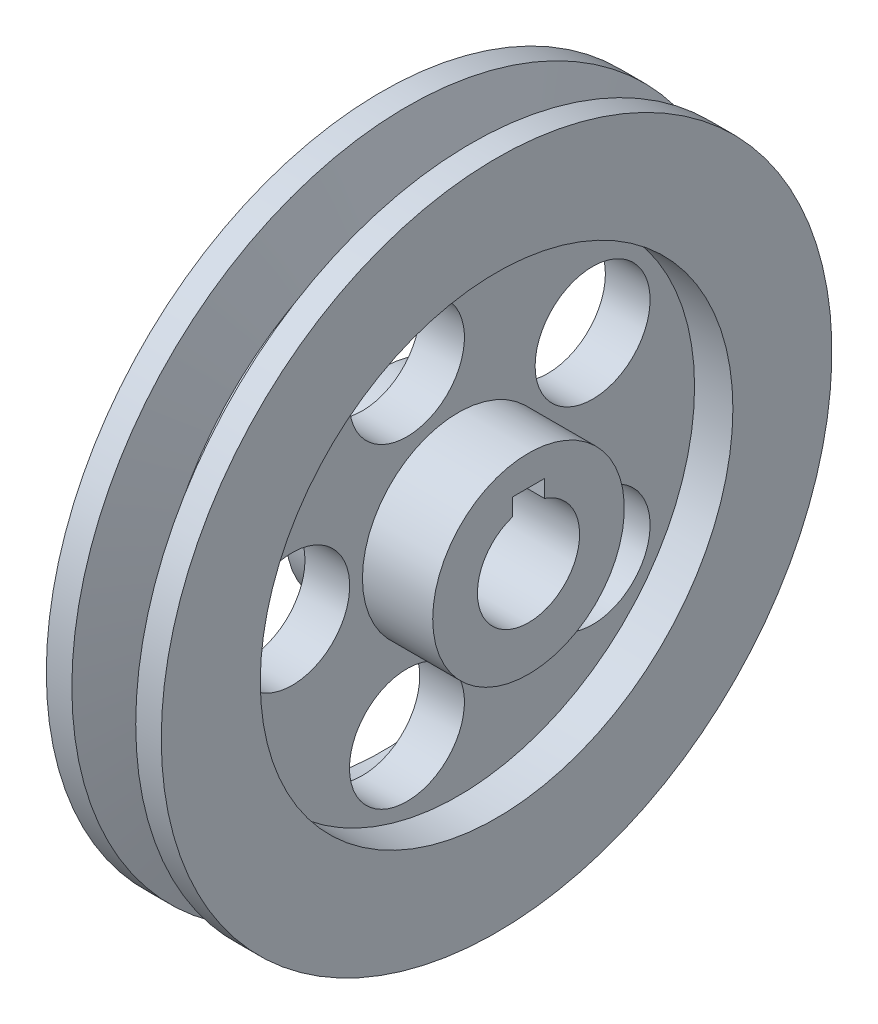
ISO-10303-21;
HEADER;
FILE_DESCRIPTION(('STEP AP214'),'2;1');
FILE_NAME('part.step','',(''),(''),'','','');
FILE_SCHEMA(('AUTOMOTIVE_DESIGN { 1 0 10303 214 1 1 1 1 }'));
ENDSEC;
DATA;
#1=APPLICATION_CONTEXT('core data for automotive mechanical design processes');
#2=APPLICATION_PROTOCOL_DEFINITION('international standard','automotive_design',2000,#1);
#3=PRODUCT_CONTEXT('',#1,'mechanical');
#4=PRODUCT('Part','Part','',(#3));
#5=PRODUCT_RELATED_PRODUCT_CATEGORY('part','',(#4));
#6=PRODUCT_DEFINITION_FORMATION('','',#4);
#7=PRODUCT_DEFINITION_CONTEXT('part definition',#1,'design');
#8=PRODUCT_DEFINITION('design','',#6,#7);
#9=PRODUCT_DEFINITION_SHAPE('','',#8);
#10=(LENGTH_UNIT() NAMED_UNIT(*) SI_UNIT(.MILLI.,.METRE.));
#11=(NAMED_UNIT(*) PLANE_ANGLE_UNIT() SI_UNIT($,.RADIAN.));
#12=(NAMED_UNIT(*) SI_UNIT($,.STERADIAN.) SOLID_ANGLE_UNIT());
#13=UNCERTAINTY_MEASURE_WITH_UNIT(LENGTH_MEASURE(1.E-05),#10,'distance_accuracy_value','');
#14=(GEOMETRIC_REPRESENTATION_CONTEXT(3) GLOBAL_UNCERTAINTY_ASSIGNED_CONTEXT((#13)) GLOBAL_UNIT_ASSIGNED_CONTEXT((#10,
#11,#12)) REPRESENTATION_CONTEXT('',''));
#15=CARTESIAN_POINT('',(0.,0.,0.));
#16=DIRECTION('',(0.,0.,1.));
#17=DIRECTION('',(1.,0.,0.));
#18=AXIS2_PLACEMENT_3D('',#15,#16,#17);
#19=CARTESIAN_POINT('',(0.,15.,0.));
#20=DIRECTION('',(1.,0.,0.));
#21=DIRECTION('',(0.,0.,-1.));
#22=AXIS2_PLACEMENT_3D('',#19,#20,#21);
#23=PLANE('',#22);
#24=CARTESIAN_POINT('',(0.,0.,0.));
#25=DIRECTION('',(-1.,0.,0.));
#26=DIRECTION('',(0.,0.,1.));
#27=AXIS2_PLACEMENT_3D('',#24,#25,#26);
#28=CIRCLE('',#27,15.);
#29=CARTESIAN_POINT('',(0.,0.,15.));
#30=VERTEX_POINT('',#29);
#31=EDGE_CURVE('E108',#30,#30,#28,.T.);
#32=ORIENTED_EDGE('',*,*,#31,.T.);
#33=EDGE_LOOP('',(#32));
#34=FACE_BOUND('',#33,.T.);
#35=DIRECTION('',(0.,1.,0.));
#36=VECTOR('',#35,1.);
#37=CARTESIAN_POINT('',(0.,15.,2.5));
#38=LINE('',#37,#36);
#39=CARTESIAN_POINT('',(0.,7.59934207678533,2.5));
#40=VERTEX_POINT('',#39);
#41=CARTESIAN_POINT('',(0.,10.3,2.5));
#42=VERTEX_POINT('',#41);
#43=EDGE_CURVE('E99',#40,#42,#38,.T.);
#44=ORIENTED_EDGE('',*,*,#43,.F.);
#45=CARTESIAN_POINT('',(0.,0.,0.));
#46=DIRECTION('',(1.,0.,0.));
#47=DIRECTION('',(0.,0.,-1.));
#48=AXIS2_PLACEMENT_3D('',#45,#46,#47);
#49=CIRCLE('',#48,8.);
#50=CARTESIAN_POINT('',(0.,7.59934207678533,-2.5));
#51=VERTEX_POINT('',#50);
#52=EDGE_CURVE('E105',#51,#40,#49,.F.);
#53=ORIENTED_EDGE('',*,*,#52,.F.);
#54=DIRECTION('',(0.,-1.,0.));
#55=VECTOR('',#54,1.);
#56=CARTESIAN_POINT('',(0.,15.,-2.5));
#57=LINE('',#56,#55);
#58=CARTESIAN_POINT('',(0.,10.3,-2.5));
#59=VERTEX_POINT('',#58);
#60=EDGE_CURVE('E55',#59,#51,#57,.T.);
#61=ORIENTED_EDGE('',*,*,#60,.F.);
#62=DIRECTION('',(0.,0.,-1.));
#63=VECTOR('',#62,1.);
#64=CARTESIAN_POINT('',(0.,10.3,0.));
#65=LINE('',#64,#63);
#66=EDGE_CURVE('E94',#42,#59,#65,.T.);
#67=ORIENTED_EDGE('',*,*,#66,.F.);
#68=EDGE_LOOP('',(#44,#53,#61,#67));
#69=FACE_BOUND('',#68,.T.);
#70=ADVANCED_FACE('F39',(#34,#69),#23,.F.);
#71=CARTESIAN_POINT('',(23.,0.,0.));
#72=DIRECTION('',(-1.,0.,0.));
#73=DIRECTION('',(0.,0.,1.));
#74=AXIS2_PLACEMENT_3D('',#71,#72,#73);
#75=PLANE('',#74);
#76=CARTESIAN_POINT('',(23.,0.,0.));
#77=DIRECTION('',(-1.,0.,0.));
#78=DIRECTION('',(0.,0.,1.));
#79=AXIS2_PLACEMENT_3D('',#76,#77,#78);
#80=CIRCLE('',#79,15.);
#81=CARTESIAN_POINT('',(23.,0.,15.));
#82=VERTEX_POINT('',#81);
#83=EDGE_CURVE('E147',#82,#82,#80,.T.);
#84=ORIENTED_EDGE('',*,*,#83,.F.);
#85=EDGE_LOOP('',(#84));
#86=FACE_BOUND('',#85,.T.);
#87=DIRECTION('',(0.,-1.,0.));
#88=VECTOR('',#87,1.);
#89=CARTESIAN_POINT('',(23.,0.,2.5));
#90=LINE('',#89,#88);
#91=CARTESIAN_POINT('',(23.,10.3,2.5));
#92=VERTEX_POINT('',#91);
#93=CARTESIAN_POINT('',(23.,7.59934207678533,2.5));
#94=VERTEX_POINT('',#93);
#95=EDGE_CURVE('E63',#92,#94,#90,.T.);
#96=ORIENTED_EDGE('',*,*,#95,.F.);
#97=DIRECTION('',(0.,0.,1.));
#98=VECTOR('',#97,1.);
#99=CARTESIAN_POINT('',(23.,10.3,0.));
#100=LINE('',#99,#98);
#101=CARTESIAN_POINT('',(23.,10.3,-2.5));
#102=VERTEX_POINT('',#101);
#103=EDGE_CURVE('E11',#102,#92,#100,.T.);
#104=ORIENTED_EDGE('',*,*,#103,.F.);
#105=DIRECTION('',(0.,1.,0.));
#106=VECTOR('',#105,1.);
#107=CARTESIAN_POINT('',(23.,0.,-2.5));
#108=LINE('',#107,#106);
#109=CARTESIAN_POINT('',(23.,7.59934207678533,-2.5));
#110=VERTEX_POINT('',#109);
#111=EDGE_CURVE('E80',#110,#102,#108,.T.);
#112=ORIENTED_EDGE('',*,*,#111,.F.);
#113=CARTESIAN_POINT('',(23.,0.,0.));
#114=DIRECTION('',(-1.,0.,0.));
#115=DIRECTION('',(0.,0.,1.));
#116=AXIS2_PLACEMENT_3D('',#113,#114,#115);
#117=CIRCLE('',#116,8.);
#118=EDGE_CURVE('E98',#94,#110,#117,.F.);
#119=ORIENTED_EDGE('',*,*,#118,.F.);
#120=EDGE_LOOP('',(#96,#104,#112,#119));
#121=FACE_BOUND('',#120,.T.);
#122=ADVANCED_FACE('F97',(#86,#121),#75,.F.);
#123=CARTESIAN_POINT('',(24.,0.,0.));
#124=DIRECTION('',(-1.,0.,0.));
#125=DIRECTION('',(0.,0.,1.));
#126=AXIS2_PLACEMENT_3D('',#123,#124,#125);
#127=CYLINDRICAL_SURFACE('',#126,8.);
#128=ORIENTED_EDGE('',*,*,#52,.T.);
#129=DIRECTION('',(-1.,0.,0.));
#130=VECTOR('',#129,1.);
#131=CARTESIAN_POINT('',(24.,7.59934207678533,2.5));
#132=LINE('',#131,#130);
#133=EDGE_CURVE('E47',#40,#94,#132,.F.);
#134=ORIENTED_EDGE('',*,*,#133,.T.);
#135=ORIENTED_EDGE('',*,*,#118,.T.);
#136=DIRECTION('',(-1.,0.,0.));
#137=VECTOR('',#136,1.);
#138=CARTESIAN_POINT('',(24.,7.59934207678533,-2.5));
#139=LINE('',#138,#137);
#140=EDGE_CURVE('E84',#110,#51,#139,.T.);
#141=ORIENTED_EDGE('',*,*,#140,.T.);
#142=EDGE_LOOP('',(#128,#134,#135,#141));
#143=FACE_BOUND('',#142,.T.);
#144=ADVANCED_FACE('F188',(#143),#127,.F.);
#145=CARTESIAN_POINT('',(-5.,0.,0.));
#146=DIRECTION('',(-1.,0.,0.));
#147=DIRECTION('',(0.,0.,1.));
#148=AXIS2_PLACEMENT_3D('',#145,#146,#147);
#149=CYLINDRICAL_SURFACE('',#148,15.);
#150=CARTESIAN_POINT('',(12.,0.,0.));
#151=DIRECTION('',(-1.,0.,0.));
#152=DIRECTION('',(0.,0.,1.));
#153=AXIS2_PLACEMENT_3D('',#150,#151,#152);
#154=CIRCLE('',#153,15.);
#155=CARTESIAN_POINT('',(12.,0.,15.));
#156=VERTEX_POINT('',#155);
#157=EDGE_CURVE('E144',#156,#156,#154,.T.);
#158=ORIENTED_EDGE('',*,*,#157,.F.);
#159=EDGE_LOOP('',(#158));
#160=FACE_BOUND('',#159,.T.);
#161=ORIENTED_EDGE('',*,*,#83,.T.);
#162=EDGE_LOOP('',(#161));
#163=FACE_BOUND('',#162,.T.);
#164=ADVANCED_FACE('F278',(#160,#163),#149,.T.);
#165=CARTESIAN_POINT('',(12.,15.,0.));
#166=DIRECTION('',(-1.,0.,0.));
#167=DIRECTION('',(0.,0.,1.));
#168=AXIS2_PLACEMENT_3D('',#165,#166,#167);
#169=PLANE('',#168);
#170=CARTESIAN_POINT('',(12.,24.727469423674,8.03444185374863));
#171=DIRECTION('',(-1.,0.,0.));
#172=DIRECTION('',(0.,0.,1.));
#173=AXIS2_PLACEMENT_3D('',#170,#171,#172);
#174=CIRCLE('',#173,9.);
#175=CARTESIAN_POINT('',(12.,24.727469423674,17.0344418537486));
#176=VERTEX_POINT('',#175);
#177=EDGE_CURVE('E167',#176,#176,#174,.F.);
#178=ORIENTED_EDGE('',*,*,#177,.F.);
#179=EDGE_LOOP('',(#178));
#180=FACE_BOUND('',#179,.T.);
#181=CARTESIAN_POINT('',(12.,15.2824165596043,-21.0344418537486));
#182=DIRECTION('',(-1.,0.,0.));
#183=DIRECTION('',(0.,0.,1.));
#184=AXIS2_PLACEMENT_3D('',#181,#182,#183);
#185=CIRCLE('',#184,9.);
#186=CARTESIAN_POINT('',(12.,15.2824165596043,-12.0344418537486));
#187=VERTEX_POINT('',#186);
#188=EDGE_CURVE('E164',#187,#187,#185,.F.);
#189=ORIENTED_EDGE('',*,*,#188,.F.);
#190=EDGE_LOOP('',(#189));
#191=FACE_BOUND('',#190,.T.);
#192=CARTESIAN_POINT('',(12.,-15.2824165596043,-21.0344418537486));
#193=DIRECTION('',(-1.,0.,0.));
#194=DIRECTION('',(0.,0.,1.));
#195=AXIS2_PLACEMENT_3D('',#192,#193,#194);
#196=CIRCLE('',#195,9.);
#197=CARTESIAN_POINT('',(12.,-15.2824165596043,-12.0344418537486));
#198=VERTEX_POINT('',#197);
#199=EDGE_CURVE('E161',#198,#198,#196,.F.);
#200=ORIENTED_EDGE('',*,*,#199,.F.);
#201=EDGE_LOOP('',(#200));
#202=FACE_BOUND('',#201,.T.);
#203=CARTESIAN_POINT('',(12.,-24.727469423674,8.03444185374864));
#204=DIRECTION('',(-1.,0.,0.));
#205=DIRECTION('',(0.,0.,1.));
#206=AXIS2_PLACEMENT_3D('',#203,#204,#205);
#207=CIRCLE('',#206,9.);
#208=CARTESIAN_POINT('',(12.,-24.727469423674,17.0344418537486));
#209=VERTEX_POINT('',#208);
#210=EDGE_CURVE('E157',#209,#209,#207,.F.);
#211=ORIENTED_EDGE('',*,*,#210,.F.);
#212=EDGE_LOOP('',(#211));
#213=FACE_BOUND('',#212,.T.);
#214=CARTESIAN_POINT('',(12.,0.,26.));
#215=DIRECTION('',(-1.,0.,0.));
#216=DIRECTION('',(0.,0.,1.));
#217=AXIS2_PLACEMENT_3D('',#214,#215,#216);
#218=CIRCLE('',#217,9.);
#219=CARTESIAN_POINT('',(12.,0.,35.));
#220=VERTEX_POINT('',#219);
#221=EDGE_CURVE('E156',#220,#220,#218,.F.);
#222=ORIENTED_EDGE('',*,*,#221,.F.);
#223=EDGE_LOOP('',(#222));
#224=FACE_BOUND('',#223,.T.);
#225=CARTESIAN_POINT('',(12.,0.,0.));
#226=DIRECTION('',(-1.,0.,0.));
#227=DIRECTION('',(0.,0.,1.));
#228=AXIS2_PLACEMENT_3D('',#225,#226,#227);
#229=CIRCLE('',#228,37.);
#230=CARTESIAN_POINT('',(12.,0.,37.));
#231=VERTEX_POINT('',#230);
#232=EDGE_CURVE('E141',#231,#231,#229,.T.);
#233=ORIENTED_EDGE('',*,*,#232,.F.);
#234=EDGE_LOOP('',(#233));
#235=FACE_BOUND('',#234,.T.);
#236=ORIENTED_EDGE('',*,*,#157,.T.);
#237=EDGE_LOOP('',(#236));
#238=FACE_BOUND('',#237,.T.);
#239=ADVANCED_FACE('F272',(#180,#191,#202,#213,#224,#235,#238),#169,.F.);
#240=CARTESIAN_POINT('',(-5.,0.,0.));
#241=DIRECTION('',(-1.,0.,0.));
#242=DIRECTION('',(0.,0.,1.));
#243=AXIS2_PLACEMENT_3D('',#240,#241,#242);
#244=CYLINDRICAL_SURFACE('',#243,37.);
#245=CARTESIAN_POINT('',(18.,0.,0.));
#246=DIRECTION('',(-1.,0.,0.));
#247=DIRECTION('',(0.,0.,1.));
#248=AXIS2_PLACEMENT_3D('',#245,#246,#247);
#249=CIRCLE('',#248,37.);
#250=CARTESIAN_POINT('',(18.,0.,37.));
#251=VERTEX_POINT('',#250);
#252=EDGE_CURVE('E138',#251,#251,#249,.T.);
#253=ORIENTED_EDGE('',*,*,#252,.F.);
#254=EDGE_LOOP('',(#253));
#255=FACE_BOUND('',#254,.T.);
#256=ORIENTED_EDGE('',*,*,#232,.T.);
#257=EDGE_LOOP('',(#256));
#258=FACE_BOUND('',#257,.T.);
#259=ADVANCED_FACE('F266',(#255,#258),#244,.F.);
#260=CARTESIAN_POINT('',(18.,37.,0.));
#261=DIRECTION('',(-1.,0.,0.));
#262=DIRECTION('',(0.,0.,1.));
#263=AXIS2_PLACEMENT_3D('',#260,#261,#262);
#264=PLANE('',#263);
#265=CARTESIAN_POINT('',(18.,0.,0.));
#266=DIRECTION('',(-1.,0.,0.));
#267=DIRECTION('',(0.,0.,1.));
#268=AXIS2_PLACEMENT_3D('',#265,#266,#267);
#269=CIRCLE('',#268,52.5);
#270=CARTESIAN_POINT('',(18.,0.,52.5));
#271=VERTEX_POINT('',#270);
#272=EDGE_CURVE('E135',#271,#271,#269,.T.);
#273=ORIENTED_EDGE('',*,*,#272,.F.);
#274=EDGE_LOOP('',(#273));
#275=FACE_BOUND('',#274,.T.);
#276=ORIENTED_EDGE('',*,*,#252,.T.);
#277=EDGE_LOOP('',(#276));
#278=FACE_BOUND('',#277,.T.);
#279=ADVANCED_FACE('F260',(#275,#278),#264,.F.);
#280=CARTESIAN_POINT('',(-5.,0.,0.));
#281=DIRECTION('',(-1.,0.,0.));
#282=DIRECTION('',(0.,0.,1.));
#283=AXIS2_PLACEMENT_3D('',#280,#281,#282);
#284=CYLINDRICAL_SURFACE('',#283,52.5);
#285=CARTESIAN_POINT('',(14.,0.,0.));
#286=DIRECTION('',(-1.,0.,0.));
#287=DIRECTION('',(0.,0.,1.));
#288=AXIS2_PLACEMENT_3D('',#285,#286,#287);
#289=CIRCLE('',#288,52.5);
#290=CARTESIAN_POINT('',(14.,0.,52.5));
#291=VERTEX_POINT('',#290);
#292=EDGE_CURVE('E132',#291,#291,#289,.T.);
#293=ORIENTED_EDGE('',*,*,#292,.F.);
#294=EDGE_LOOP('',(#293));
#295=FACE_BOUND('',#294,.T.);
#296=ORIENTED_EDGE('',*,*,#272,.T.);
#297=EDGE_LOOP('',(#296));
#298=FACE_BOUND('',#297,.T.);
#299=ADVANCED_FACE('F254',(#295,#298),#284,.T.);
#300=CARTESIAN_POINT('',(14.,0.,0.));
#301=DIRECTION('',(1.,0.,0.));
#302=DIRECTION('',(0.,0.,-1.));
#303=AXIS2_PLACEMENT_3D('',#300,#301,#302);
#304=CONICAL_SURFACE('',#303,52.5,1.30899693899575);
#305=CARTESIAN_POINT('',(11.3205080756888,0.,0.));
#306=DIRECTION('',(-1.,0.,0.));
#307=DIRECTION('',(0.,0.,1.));
#308=AXIS2_PLACEMENT_3D('',#305,#306,#307);
#309=CIRCLE('',#308,42.5);
#310=CARTESIAN_POINT('',(11.3205080756888,0.,42.5));
#311=VERTEX_POINT('',#310);
#312=EDGE_CURVE('E129',#311,#311,#309,.T.);
#313=ORIENTED_EDGE('',*,*,#312,.F.);
#314=EDGE_LOOP('',(#313));
#315=FACE_BOUND('',#314,.T.);
#316=ORIENTED_EDGE('',*,*,#292,.T.);
#317=EDGE_LOOP('',(#316));
#318=FACE_BOUND('',#317,.T.);
#319=ADVANCED_FACE('F248',(#315,#318),#304,.T.);
#320=CARTESIAN_POINT('',(-5.,0.,0.));
#321=DIRECTION('',(-1.,0.,0.));
#322=DIRECTION('',(0.,0.,1.));
#323=AXIS2_PLACEMENT_3D('',#320,#321,#322);
#324=CYLINDRICAL_SURFACE('',#323,42.5);
#325=CARTESIAN_POINT('',(6.67949192431123,0.,0.));
#326=DIRECTION('',(-1.,0.,0.));
#327=DIRECTION('',(0.,0.,1.));
#328=AXIS2_PLACEMENT_3D('',#325,#326,#327);
#329=CIRCLE('',#328,42.5);
#330=CARTESIAN_POINT('',(6.67949192431123,0.,42.5));
#331=VERTEX_POINT('',#330);
#332=EDGE_CURVE('E126',#331,#331,#329,.T.);
#333=ORIENTED_EDGE('',*,*,#332,.F.);
#334=EDGE_LOOP('',(#333));
#335=FACE_BOUND('',#334,.T.);
#336=ORIENTED_EDGE('',*,*,#312,.T.);
#337=EDGE_LOOP('',(#336));
#338=FACE_BOUND('',#337,.T.);
#339=ADVANCED_FACE('F242',(#335,#338),#324,.T.);
#340=CARTESIAN_POINT('',(6.67949192431123,0.,0.));
#341=DIRECTION('',(-1.,0.,0.));
#342=DIRECTION('',(0.,0.,1.));
#343=AXIS2_PLACEMENT_3D('',#340,#341,#342);
#344=CONICAL_SURFACE('',#343,42.5,1.30899693899575);
#345=CARTESIAN_POINT('',(4.,0.,0.));
#346=DIRECTION('',(-1.,0.,0.));
#347=DIRECTION('',(0.,0.,1.));
#348=AXIS2_PLACEMENT_3D('',#345,#346,#347);
#349=CIRCLE('',#348,52.5);
#350=CARTESIAN_POINT('',(4.,0.,52.5));
#351=VERTEX_POINT('',#350);
#352=EDGE_CURVE('E123',#351,#351,#349,.T.);
#353=ORIENTED_EDGE('',*,*,#352,.F.);
#354=EDGE_LOOP('',(#353));
#355=FACE_BOUND('',#354,.T.);
#356=ORIENTED_EDGE('',*,*,#332,.T.);
#357=EDGE_LOOP('',(#356));
#358=FACE_BOUND('',#357,.T.);
#359=ADVANCED_FACE('F236',(#355,#358),#344,.T.);
#360=CARTESIAN_POINT('',(-5.,0.,0.));
#361=DIRECTION('',(-1.,0.,0.));
#362=DIRECTION('',(0.,0.,1.));
#363=AXIS2_PLACEMENT_3D('',#360,#361,#362);
#364=CYLINDRICAL_SURFACE('',#363,52.5);
#365=CARTESIAN_POINT('',(0.,0.,0.));
#366=DIRECTION('',(-1.,0.,0.));
#367=DIRECTION('',(0.,0.,1.));
#368=AXIS2_PLACEMENT_3D('',#365,#366,#367);
#369=CIRCLE('',#368,52.5);
#370=CARTESIAN_POINT('',(0.,0.,52.5));
#371=VERTEX_POINT('',#370);
#372=EDGE_CURVE('E120',#371,#371,#369,.T.);
#373=ORIENTED_EDGE('',*,*,#372,.F.);
#374=EDGE_LOOP('',(#373));
#375=FACE_BOUND('',#374,.T.);
#376=ORIENTED_EDGE('',*,*,#352,.T.);
#377=EDGE_LOOP('',(#376));
#378=FACE_BOUND('',#377,.T.);
#379=ADVANCED_FACE('F230',(#375,#378),#364,.T.);
#380=CARTESIAN_POINT('',(0.,52.5,0.));
#381=DIRECTION('',(1.,0.,0.));
#382=DIRECTION('',(0.,0.,-1.));
#383=AXIS2_PLACEMENT_3D('',#380,#381,#382);
#384=PLANE('',#383);
#385=CARTESIAN_POINT('',(0.,0.,0.));
#386=DIRECTION('',(-1.,0.,0.));
#387=DIRECTION('',(0.,0.,1.));
#388=AXIS2_PLACEMENT_3D('',#385,#386,#387);
#389=CIRCLE('',#388,37.);
#390=CARTESIAN_POINT('',(0.,0.,37.));
#391=VERTEX_POINT('',#390);
#392=EDGE_CURVE('E117',#391,#391,#389,.T.);
#393=ORIENTED_EDGE('',*,*,#392,.F.);
#394=EDGE_LOOP('',(#393));
#395=FACE_BOUND('',#394,.T.);
#396=ORIENTED_EDGE('',*,*,#372,.T.);
#397=EDGE_LOOP('',(#396));
#398=FACE_BOUND('',#397,.T.);
#399=ADVANCED_FACE('F224',(#395,#398),#384,.F.);
#400=CARTESIAN_POINT('',(-5.,0.,0.));
#401=DIRECTION('',(-1.,0.,0.));
#402=DIRECTION('',(0.,0.,1.));
#403=AXIS2_PLACEMENT_3D('',#400,#401,#402);
#404=CYLINDRICAL_SURFACE('',#403,37.);
#405=CARTESIAN_POINT('',(5.,0.,0.));
#406=DIRECTION('',(-1.,0.,0.));
#407=DIRECTION('',(0.,0.,1.));
#408=AXIS2_PLACEMENT_3D('',#405,#406,#407);
#409=CIRCLE('',#408,37.);
#410=CARTESIAN_POINT('',(5.,0.,37.));
#411=VERTEX_POINT('',#410);
#412=EDGE_CURVE('E114',#411,#411,#409,.T.);
#413=ORIENTED_EDGE('',*,*,#412,.F.);
#414=EDGE_LOOP('',(#413));
#415=FACE_BOUND('',#414,.T.);
#416=ORIENTED_EDGE('',*,*,#392,.T.);
#417=EDGE_LOOP('',(#416));
#418=FACE_BOUND('',#417,.T.);
#419=ADVANCED_FACE('F217',(#415,#418),#404,.F.);
#420=CARTESIAN_POINT('',(5.,37.,0.));
#421=DIRECTION('',(1.,0.,0.));
#422=DIRECTION('',(0.,0.,-1.));
#423=AXIS2_PLACEMENT_3D('',#420,#421,#422);
#424=PLANE('',#423);
#425=CARTESIAN_POINT('',(5.,24.727469423674,8.03444185374863));
#426=DIRECTION('',(1.,0.,0.));
#427=DIRECTION('',(0.,0.,-1.));
#428=AXIS2_PLACEMENT_3D('',#425,#426,#427);
#429=CIRCLE('',#428,9.);
#430=CARTESIAN_POINT('',(5.,24.727469423674,-0.965558146251372));
#431=VERTEX_POINT('',#430);
#432=EDGE_CURVE('E42',#431,#431,#429,.F.);
#433=ORIENTED_EDGE('',*,*,#432,.F.);
#434=EDGE_LOOP('',(#433));
#435=FACE_BOUND('',#434,.T.);
#436=CARTESIAN_POINT('',(5.,15.2824165596043,-21.0344418537486));
#437=DIRECTION('',(1.,0.,0.));
#438=DIRECTION('',(0.,0.,-1.));
#439=AXIS2_PLACEMENT_3D('',#436,#437,#438);
#440=CIRCLE('',#439,9.);
#441=CARTESIAN_POINT('',(5.,15.2824165596043,-30.0344418537486));
#442=VERTEX_POINT('',#441);
#443=EDGE_CURVE('E165',#442,#442,#440,.F.);
#444=ORIENTED_EDGE('',*,*,#443,.F.);
#445=EDGE_LOOP('',(#444));
#446=FACE_BOUND('',#445,.T.);
#447=CARTESIAN_POINT('',(5.,-15.2824165596043,-21.0344418537486));
#448=DIRECTION('',(1.,0.,0.));
#449=DIRECTION('',(0.,0.,-1.));
#450=AXIS2_PLACEMENT_3D('',#447,#448,#449);
#451=CIRCLE('',#450,9.);
#452=CARTESIAN_POINT('',(5.,-15.2824165596043,-30.0344418537486));
#453=VERTEX_POINT('',#452);
#454=EDGE_CURVE('E162',#453,#453,#451,.F.);
#455=ORIENTED_EDGE('',*,*,#454,.F.);
#456=EDGE_LOOP('',(#455));
#457=FACE_BOUND('',#456,.T.);
#458=CARTESIAN_POINT('',(5.,-24.727469423674,8.03444185374864));
#459=DIRECTION('',(1.,0.,0.));
#460=DIRECTION('',(0.,0.,-1.));
#461=AXIS2_PLACEMENT_3D('',#458,#459,#460);
#462=CIRCLE('',#461,9.);
#463=CARTESIAN_POINT('',(5.,-24.727469423674,-0.965558146251363));
#464=VERTEX_POINT('',#463);
#465=EDGE_CURVE('E158',#464,#464,#462,.F.);
#466=ORIENTED_EDGE('',*,*,#465,.F.);
#467=EDGE_LOOP('',(#466));
#468=FACE_BOUND('',#467,.T.);
#469=CARTESIAN_POINT('',(5.,0.,26.));
#470=DIRECTION('',(1.,0.,0.));
#471=DIRECTION('',(0.,0.,-1.));
#472=AXIS2_PLACEMENT_3D('',#469,#470,#471);
#473=CIRCLE('',#472,9.);
#474=CARTESIAN_POINT('',(5.,0.,17.));
#475=VERTEX_POINT('',#474);
#476=EDGE_CURVE('E153',#475,#475,#473,.F.);
#477=ORIENTED_EDGE('',*,*,#476,.F.);
#478=EDGE_LOOP('',(#477));
#479=FACE_BOUND('',#478,.T.);
#480=CARTESIAN_POINT('',(5.,0.,0.));
#481=DIRECTION('',(-1.,0.,0.));
#482=DIRECTION('',(0.,0.,1.));
#483=AXIS2_PLACEMENT_3D('',#480,#481,#482);
#484=CIRCLE('',#483,15.);
#485=CARTESIAN_POINT('',(5.,0.,15.));
#486=VERTEX_POINT('',#485);
#487=EDGE_CURVE('E111',#486,#486,#484,.T.);
#488=ORIENTED_EDGE('',*,*,#487,.F.);
#489=EDGE_LOOP('',(#488));
#490=FACE_BOUND('',#489,.T.);
#491=ORIENTED_EDGE('',*,*,#412,.T.);
#492=EDGE_LOOP('',(#491));
#493=FACE_BOUND('',#492,.T.);
#494=ADVANCED_FACE('F211',(#435,#446,#457,#468,#479,#490,#493),#424,.F.);
#495=CARTESIAN_POINT('',(-5.,0.,0.));
#496=DIRECTION('',(-1.,0.,0.));
#497=DIRECTION('',(0.,0.,1.));
#498=AXIS2_PLACEMENT_3D('',#495,#496,#497);
#499=CYLINDRICAL_SURFACE('',#498,15.);
#500=ORIENTED_EDGE('',*,*,#31,.F.);
#501=EDGE_LOOP('',(#500));
#502=FACE_BOUND('',#501,.T.);
#503=ORIENTED_EDGE('',*,*,#487,.T.);
#504=EDGE_LOOP('',(#503));
#505=FACE_BOUND('',#504,.T.);
#506=ADVANCED_FACE('F198',(#502,#505),#499,.T.);
#507=CARTESIAN_POINT('',(24.,10.3,-2.5));
#508=DIRECTION('',(0.,-1.,0.));
#509=DIRECTION('',(0.,0.,-1.));
#510=AXIS2_PLACEMENT_3D('',#507,#508,#509);
#511=PLANE('',#510);
#512=ORIENTED_EDGE('',*,*,#66,.T.);
#513=DIRECTION('',(-1.,0.,0.));
#514=VECTOR('',#513,1.);
#515=CARTESIAN_POINT('',(24.,10.3,-2.5));
#516=LINE('',#515,#514);
#517=EDGE_CURVE('E83',#102,#59,#516,.T.);
#518=ORIENTED_EDGE('',*,*,#517,.F.);
#519=ORIENTED_EDGE('',*,*,#103,.T.);
#520=DIRECTION('',(-1.,0.,0.));
#521=VECTOR('',#520,1.);
#522=CARTESIAN_POINT('',(24.,10.3,2.5));
#523=LINE('',#522,#521);
#524=EDGE_CURVE('E95',#92,#42,#523,.T.);
#525=ORIENTED_EDGE('',*,*,#524,.T.);
#526=EDGE_LOOP('',(#512,#518,#519,#525));
#527=FACE_BOUND('',#526,.T.);
#528=ADVANCED_FACE('F91',(#527),#511,.T.);
#529=CARTESIAN_POINT('',(24.,10.3,2.5));
#530=DIRECTION('',(0.,0.,-1.));
#531=DIRECTION('',(-1.,0.,0.));
#532=AXIS2_PLACEMENT_3D('',#529,#530,#531);
#533=PLANE('',#532);
#534=ORIENTED_EDGE('',*,*,#43,.T.);
#535=ORIENTED_EDGE('',*,*,#524,.F.);
#536=ORIENTED_EDGE('',*,*,#95,.T.);
#537=ORIENTED_EDGE('',*,*,#133,.F.);
#538=EDGE_LOOP('',(#534,#535,#536,#537));
#539=FACE_BOUND('',#538,.T.);
#540=ADVANCED_FACE('F189',(#539),#533,.T.);
#541=CARTESIAN_POINT('',(24.,7.,-2.5));
#542=DIRECTION('',(0.,0.,1.));
#543=DIRECTION('',(1.,0.,0.));
#544=AXIS2_PLACEMENT_3D('',#541,#542,#543);
#545=PLANE('',#544);
#546=ORIENTED_EDGE('',*,*,#60,.T.);
#547=ORIENTED_EDGE('',*,*,#140,.F.);
#548=ORIENTED_EDGE('',*,*,#111,.T.);
#549=ORIENTED_EDGE('',*,*,#517,.T.);
#550=EDGE_LOOP('',(#546,#547,#548,#549));
#551=FACE_BOUND('',#550,.T.);
#552=ADVANCED_FACE('F82',(#551),#545,.T.);
#553=CARTESIAN_POINT('',(13.,0.,26.));
#554=DIRECTION('',(-1.,0.,0.));
#555=DIRECTION('',(0.,0.,1.));
#556=AXIS2_PLACEMENT_3D('',#553,#554,#555);
#557=CYLINDRICAL_SURFACE('',#556,9.);
#558=ORIENTED_EDGE('',*,*,#476,.T.);
#559=EDGE_LOOP('',(#558));
#560=FACE_BOUND('',#559,.T.);
#561=ORIENTED_EDGE('',*,*,#221,.T.);
#562=EDGE_LOOP('',(#561));
#563=FACE_BOUND('',#562,.T.);
#564=ADVANCED_FACE('F196',(#560,#563),#557,.F.);
#565=CARTESIAN_POINT('',(13.,-24.727469423674,8.03444185374864));
#566=DIRECTION('',(-1.,0.,0.));
#567=DIRECTION('',(0.,0.,1.));
#568=AXIS2_PLACEMENT_3D('',#565,#566,#567);
#569=CYLINDRICAL_SURFACE('',#568,9.);
#570=ORIENTED_EDGE('',*,*,#465,.T.);
#571=EDGE_LOOP('',(#570));
#572=FACE_BOUND('',#571,.T.);
#573=ORIENTED_EDGE('',*,*,#210,.T.);
#574=EDGE_LOOP('',(#573));
#575=FACE_BOUND('',#574,.T.);
#576=ADVANCED_FACE('F421',(#572,#575),#569,.F.);
#577=CARTESIAN_POINT('',(13.,-15.2824165596043,-21.0344418537486));
#578=DIRECTION('',(-1.,0.,0.));
#579=DIRECTION('',(0.,0.,1.));
#580=AXIS2_PLACEMENT_3D('',#577,#578,#579);
#581=CYLINDRICAL_SURFACE('',#580,9.);
#582=ORIENTED_EDGE('',*,*,#454,.T.);
#583=EDGE_LOOP('',(#582));
#584=FACE_BOUND('',#583,.T.);
#585=ORIENTED_EDGE('',*,*,#199,.T.);
#586=EDGE_LOOP('',(#585));
#587=FACE_BOUND('',#586,.T.);
#588=ADVANCED_FACE('F417',(#584,#587),#581,.F.);
#589=CARTESIAN_POINT('',(13.,15.2824165596043,-21.0344418537486));
#590=DIRECTION('',(-1.,0.,0.));
#591=DIRECTION('',(0.,0.,1.));
#592=AXIS2_PLACEMENT_3D('',#589,#590,#591);
#593=CYLINDRICAL_SURFACE('',#592,9.);
#594=ORIENTED_EDGE('',*,*,#443,.T.);
#595=EDGE_LOOP('',(#594));
#596=FACE_BOUND('',#595,.T.);
#597=ORIENTED_EDGE('',*,*,#188,.T.);
#598=EDGE_LOOP('',(#597));
#599=FACE_BOUND('',#598,.T.);
#600=ADVANCED_FACE('F394',(#596,#599),#593,.F.);
#601=CARTESIAN_POINT('',(13.,24.727469423674,8.03444185374863));
#602=DIRECTION('',(-1.,0.,0.));
#603=DIRECTION('',(0.,0.,1.));
#604=AXIS2_PLACEMENT_3D('',#601,#602,#603);
#605=CYLINDRICAL_SURFACE('',#604,9.);
#606=ORIENTED_EDGE('',*,*,#432,.T.);
#607=EDGE_LOOP('',(#606));
#608=FACE_BOUND('',#607,.T.);
#609=ORIENTED_EDGE('',*,*,#177,.T.);
#610=EDGE_LOOP('',(#609));
#611=FACE_BOUND('',#610,.T.);
#612=ADVANCED_FACE('F405',(#608,#611),#605,.F.);
#613=CLOSED_SHELL('',(#70,#122,#144,#164,#239,#259,#279,#299,#319,#339,#359,#379,#399,#419,#494,
#506,#528,#540,#552,#564,#576,#588,#600,#612));
#614=MANIFOLD_SOLID_BREP('B2',#613);
#615=ADVANCED_BREP_SHAPE_REPRESENTATION('',(#18,#614),#14);
#616=SHAPE_DEFINITION_REPRESENTATION(#9,#615);
ENDSEC;
END-ISO-10303-21;
